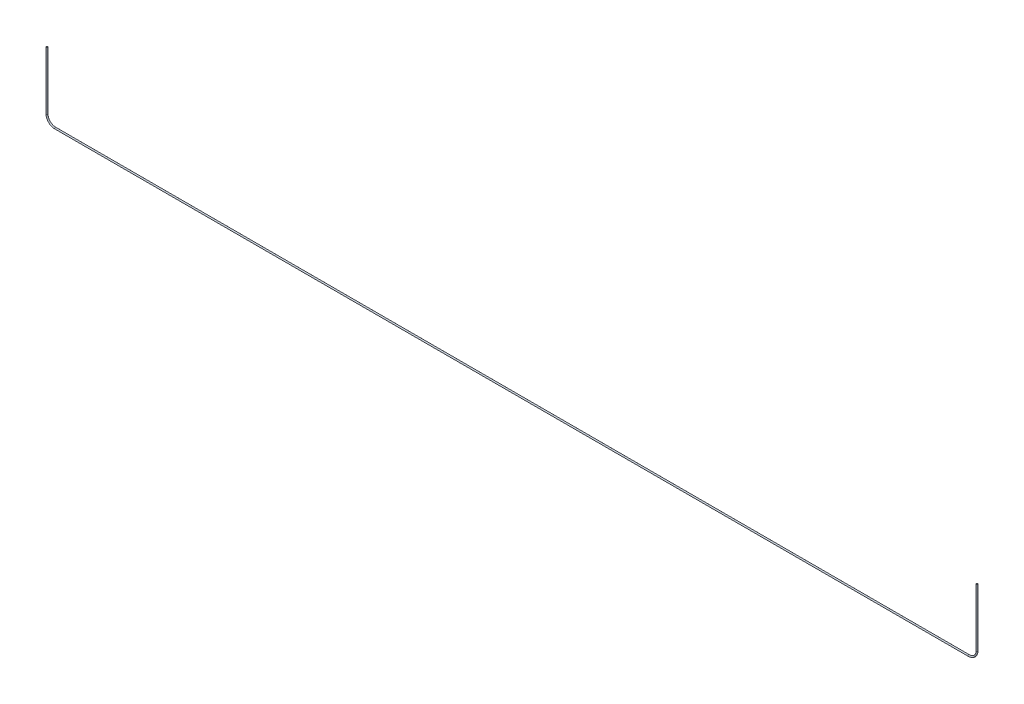
ISO-10303-21;
HEADER;
FILE_DESCRIPTION(('STEP AP214'),'2;1');
FILE_NAME('part.step','',(''),(''),'','','');
FILE_SCHEMA(('AUTOMOTIVE_DESIGN { 1 0 10303 214 1 1 1 1 }'));
ENDSEC;
DATA;
#1=APPLICATION_CONTEXT('core data for automotive mechanical design processes');
#2=APPLICATION_PROTOCOL_DEFINITION('international standard','automotive_design',2000,#1);
#3=PRODUCT_CONTEXT('',#1,'mechanical');
#4=PRODUCT('Part','Part','',(#3));
#5=PRODUCT_RELATED_PRODUCT_CATEGORY('part','',(#4));
#6=PRODUCT_DEFINITION_FORMATION('','',#4);
#7=PRODUCT_DEFINITION_CONTEXT('part definition',#1,'design');
#8=PRODUCT_DEFINITION('design','',#6,#7);
#9=PRODUCT_DEFINITION_SHAPE('','',#8);
#10=(LENGTH_UNIT() NAMED_UNIT(*) SI_UNIT(.MILLI.,.METRE.));
#11=(NAMED_UNIT(*) PLANE_ANGLE_UNIT() SI_UNIT($,.RADIAN.));
#12=(NAMED_UNIT(*) SI_UNIT($,.STERADIAN.) SOLID_ANGLE_UNIT());
#13=UNCERTAINTY_MEASURE_WITH_UNIT(LENGTH_MEASURE(1.E-05),#10,'distance_accuracy_value','');
#14=(GEOMETRIC_REPRESENTATION_CONTEXT(3) GLOBAL_UNCERTAINTY_ASSIGNED_CONTEXT((#13)) GLOBAL_UNIT_ASSIGNED_CONTEXT((#10,
#11,#12)) REPRESENTATION_CONTEXT('',''));
#15=CARTESIAN_POINT('',(0.,0.,0.));
#16=DIRECTION('',(0.,0.,1.));
#17=DIRECTION('',(1.,0.,0.));
#18=AXIS2_PLACEMENT_3D('',#15,#16,#17);
#19=CARTESIAN_POINT('',(4219.99999999904,600.000000000098,1.29229960066368E-10));
#20=DIRECTION('',(0.,0.999999999999956,0.));
#21=DIRECTION('',(0.,0.,-1.00000000000003));
#22=AXIS2_PLACEMENT_3D('',#19,#20,#21);
#23=PLANE('',#22);
#24=CARTESIAN_POINT('',(4219.99999999904,600.000000000098,1.29229960066368E-10));
#25=DIRECTION('',(0.,0.999999999999956,0.));
#26=DIRECTION('',(0.,0.,-1.00000000000003));
#27=AXIS2_PLACEMENT_3D('',#24,#25,#26);
#28=CIRCLE('',#27,6.3500000000003);
#29=CARTESIAN_POINT('',(4219.99999999904,600.000000000098,-6.34999999987125));
#30=VERTEX_POINT('',#29);
#31=EDGE_CURVE('E75',#30,#30,#28,.T.);
#32=ORIENTED_EDGE('',*,*,#31,.T.);
#33=EDGE_LOOP('',(#32));
#34=FACE_BOUND('',#33,.T.);
#35=ADVANCED_FACE('F46',(#34),#23,.T.);
#36=CARTESIAN_POINT('',(-4219.99999999934,599.999999999847,-8.92619311798626E-11));
#37=DIRECTION('',(0.,-0.999999999999956,0.));
#38=DIRECTION('',(0.,0.,-1.00000000000003));
#39=AXIS2_PLACEMENT_3D('',#36,#37,#38);
#40=PLANE('',#39);
#41=CARTESIAN_POINT('',(-4219.99999999934,599.999999999847,-8.92619311798626E-11));
#42=DIRECTION('',(0.,-0.999999999999956,0.));
#43=DIRECTION('',(0.,0.,-1.00000000000003));
#44=AXIS2_PLACEMENT_3D('',#41,#42,#43);
#45=CIRCLE('',#44,6.3500000000003);
#46=CARTESIAN_POINT('',(-4219.99999999934,599.999999999847,-6.35000000008974));
#47=VERTEX_POINT('',#46);
#48=EDGE_CURVE('E11',#47,#47,#45,.T.);
#49=ORIENTED_EDGE('',*,*,#48,.F.);
#50=EDGE_LOOP('',(#49));
#51=FACE_BOUND('',#50,.T.);
#52=ADVANCED_FACE('F85',(#51),#40,.F.);
#53=CARTESIAN_POINT('',(4219.99999999904,600.000000000098,1.29229960066368E-10));
#54=DIRECTION('',(0.,-0.999999999999956,0.));
#55=DIRECTION('',(0.,0.,-1.00000000000003));
#56=AXIS2_PLACEMENT_3D('',#53,#54,#55);
#57=CYLINDRICAL_SURFACE('',#56,6.3500000000003);
#58=CARTESIAN_POINT('',(4219.9999999993,75.0000000001099,9.32587340685131E-11));
#59=DIRECTION('',(0.,0.999999999999956,0.));
#60=DIRECTION('',(0.,0.,-1.00000000000003));
#61=AXIS2_PLACEMENT_3D('',#58,#59,#60);
#62=CIRCLE('',#61,6.3500000000003);
#63=CARTESIAN_POINT('',(4226.34999999929,75.0000000001105,9.05515662452728E-11));
#64=VERTEX_POINT('',#63);
#65=EDGE_CURVE('E71',#64,#64,#62,.T.);
#66=ORIENTED_EDGE('',*,*,#65,.T.);
#67=EDGE_LOOP('',(#66));
#68=FACE_BOUND('',#67,.T.);
#69=ORIENTED_EDGE('',*,*,#31,.F.);
#70=EDGE_LOOP('',(#69));
#71=FACE_BOUND('',#70,.T.);
#72=ADVANCED_FACE('F82',(#68,#71),#57,.T.);
#73=CARTESIAN_POINT('',(4144.99999999929,75.0000000001028,1.25233157177718E-10));
#74=DIRECTION('',(0.,0.,-1.00000000000003));
#75=DIRECTION('',(-0.999999999999859,0.,0.));
#76=AXIS2_PLACEMENT_3D('',#73,#74,#75);
#77=TOROIDAL_SURFACE('',#76,75.0000000000002,6.3500000000003);
#78=CARTESIAN_POINT('',(4144.99999999928,1.08801856413265E-10,1.05693231944315E-10));
#79=DIRECTION('',(0.999999999999859,0.,0.));
#80=DIRECTION('',(0.,0.,-1.00000000000003));
#81=AXIS2_PLACEMENT_3D('',#78,#79,#80);
#82=CIRCLE('',#81,6.3500000000003);
#83=CARTESIAN_POINT('',(4144.99999999928,-6.34999999989772,1.04038851607885E-10));
#84=VERTEX_POINT('',#83);
#85=EDGE_CURVE('E65',#84,#84,#82,.T.);
#86=CARTESIAN_POINT('',(4144.99999999929,75.0000000001028,1.25233157177718E-10));
#87=DIRECTION('',(0.,0.,-1.00000000000003));
#88=DIRECTION('',(-0.999999999999859,0.,0.));
#89=AXIS2_PLACEMENT_3D('',#86,#87,#88);
#90=CIRCLE('',#89,81.3500000000005);
#91=EDGE_CURVE('',#64,#84,#90,.T.);
#92=ORIENTED_EDGE('',*,*,#65,.F.);
#93=ORIENTED_EDGE('',*,*,#85,.T.);
#94=ORIENTED_EDGE('',*,*,#91,.T.);
#95=ORIENTED_EDGE('',*,*,#91,.F.);
#96=EDGE_LOOP('',(#92,#94,#93,#95));
#97=FACE_BOUND('',#96,.T.);
#98=ADVANCED_FACE('F84',(#97),#77,.T.);
#99=CARTESIAN_POINT('',(4144.99999999928,1.08801856413265E-10,1.05693231944315E-10));
#100=DIRECTION('',(-0.999999999999859,0.,0.));
#101=DIRECTION('',(0.,-0.99999999999999,0.));
#102=AXIS2_PLACEMENT_3D('',#99,#100,#101);
#103=CYLINDRICAL_SURFACE('',#102,6.3500000000003);
#104=CARTESIAN_POINT('',(-4144.99999999907,-1.02584607475364E-10,-1.22568621918617E-10));
#105=DIRECTION('',(0.999999999999859,0.,0.));
#106=DIRECTION('',(0.,0.,-1.00000000000003));
#107=AXIS2_PLACEMENT_3D('',#104,#105,#106);
#108=CIRCLE('',#107,6.3500000000003);
#109=CARTESIAN_POINT('',(-4144.99999999907,-6.35000000009898,-9.86402154401371E-11));
#110=VERTEX_POINT('',#109);
#111=EDGE_CURVE('E59',#110,#110,#108,.T.);
#112=CARTESIAN_POINT('',(-4144.99999999907,-6.35000000009898,-9.86402154401371E-11));
#113=CARTESIAN_POINT('',(-4058.64583333242,-6.35000000009682,-9.65118485129918E-11));
#114=CARTESIAN_POINT('',(-3972.29166666577,-6.35000000009465,-9.43834815858465E-11));
#115=CARTESIAN_POINT('',(-3799.58333333248,-6.35000000009033,-9.01267477315558E-11));
#116=CARTESIAN_POINT('',(-3713.22916666583,-6.35000000008817,-8.79983808044104E-11));
#117=CARTESIAN_POINT('',(-3540.52083333253,-6.35000000008384,-8.37416469501197E-11));
#118=CARTESIAN_POINT('',(-3454.16666666588,-6.35000000008168,-8.16132800229744E-11));
#119=CARTESIAN_POINT('',(-3281.45833333258,-6.35000000007736,-7.73565461686837E-11));
#120=CARTESIAN_POINT('',(-3195.10416666593,-6.3500000000752,-7.52281792415384E-11));
#121=CARTESIAN_POINT('',(-3022.39583333263,-6.35000000007087,-7.09714453872477E-11));
#122=CARTESIAN_POINT('',(-2936.04166666598,-6.35000000006871,-6.88430784601024E-11));
#123=CARTESIAN_POINT('',(-2763.33333333268,-6.35000000006439,-6.45863446058117E-11));
#124=CARTESIAN_POINT('',(-2676.97916666603,-6.35000000006222,-6.24579776786663E-11));
#125=CARTESIAN_POINT('',(-2504.27083333273,-6.3500000000579,-5.82012438243757E-11));
#126=CARTESIAN_POINT('',(-2417.91666666608,-6.35000000005574,-5.60728768972303E-11));
#127=CARTESIAN_POINT('',(-2245.20833333278,-6.35000000005141,-5.18161430429396E-11));
#128=CARTESIAN_POINT('',(-2158.85416666613,-6.35000000004925,-4.96877761157943E-11));
#129=CARTESIAN_POINT('',(-1986.14583333284,-6.35000000004493,-4.54310422615036E-11));
#130=CARTESIAN_POINT('',(-1899.79166666619,-6.35000000004277,-4.33026753343583E-11));
#131=CARTESIAN_POINT('',(-1727.08333333289,-6.35000000003844,-3.90459414800676E-11));
#132=CARTESIAN_POINT('',(-1640.72916666624,-6.35000000003628,-3.69175745529222E-11));
#133=CARTESIAN_POINT('',(-1468.02083333294,-6.35000000003196,-3.26608406986316E-11));
#134=CARTESIAN_POINT('',(-1381.66666666629,-6.3500000000298,-3.05324737714862E-11));
#135=CARTESIAN_POINT('',(-1208.95833333299,-6.35000000002547,-2.62757399171955E-11));
#136=CARTESIAN_POINT('',(-1122.60416666634,-6.35000000002331,-2.41473729900502E-11));
#137=CARTESIAN_POINT('',(-949.895833333041,-6.35000000001899,-1.98906391357595E-11));
#138=CARTESIAN_POINT('',(-863.541666666392,-6.35000000001682,-1.77622722086142E-11));
#139=CARTESIAN_POINT('',(-690.833333333093,-6.3500000000125,-1.35055383543235E-11));
#140=CARTESIAN_POINT('',(-604.479166666444,-6.35000000001034,-1.13771714271781E-11));
#141=CARTESIAN_POINT('',(-431.770833333145,-6.35000000000601,-7.12043757288745E-12));
#142=CARTESIAN_POINT('',(-345.416666666495,-6.35000000000385,-4.9920706457421E-12));
#143=CARTESIAN_POINT('',(-172.708333333196,-6.34999999999953,-7.35336791451418E-13));
#144=CARTESIAN_POINT('',(-86.3541666665464,-6.34999999999737,1.39303013569392E-12));
#145=CARTESIAN_POINT('',(86.3541666667524,-6.34999999999304,5.6497639899846E-12));
#146=CARTESIAN_POINT('',(172.708333333402,-6.34999999999088,7.77813091712994E-12));
#147=CARTESIAN_POINT('',(345.416666666701,-6.34999999998656,1.20348647714206E-11));
#148=CARTESIAN_POINT('',(431.77083333335,-6.3499999999844,1.4163231698566E-11));
#149=CARTESIAN_POINT('',(604.47916666665,-6.34999999998007,1.84199655528567E-11));
#150=CARTESIAN_POINT('',(690.833333333299,-6.34999999997791,2.0548332480002E-11));
#151=CARTESIAN_POINT('',(863.541666666599,-6.34999999997359,2.48050663342927E-11));
#152=CARTESIAN_POINT('',(949.895833333248,-6.34999999997142,2.6933433261438E-11));
#153=CARTESIAN_POINT('',(1122.60416666655,-6.3499999999671,3.11901671157287E-11));
#154=CARTESIAN_POINT('',(1208.9583333332,-6.34999999996494,3.3318534042874E-11));
#155=CARTESIAN_POINT('',(1381.66666666649,-6.34999999996061,3.75752678971647E-11));
#156=CARTESIAN_POINT('',(1468.02083333314,-6.34999999995845,3.97036348243101E-11));
#157=CARTESIAN_POINT('',(1640.72916666644,-6.34999999995413,4.39603686786008E-11));
#158=CARTESIAN_POINT('',(1727.08333333309,-6.34999999995197,4.60887356057461E-11));
#159=CARTESIAN_POINT('',(1899.79166666639,-6.34999999994764,5.03454694600368E-11));
#160=CARTESIAN_POINT('',(1986.14583333304,-6.34999999994548,5.24738363871821E-11));
#161=CARTESIAN_POINT('',(2158.85416666634,-6.34999999994116,5.67305702414728E-11));
#162=CARTESIAN_POINT('',(2245.20833333299,-6.349999999939,5.88589371686181E-11));
#163=CARTESIAN_POINT('',(2417.91666666629,-6.34999999993467,6.31156710229088E-11));
#164=CARTESIAN_POINT('',(2504.27083333294,-6.34999999993251,6.52440379500542E-11));
#165=CARTESIAN_POINT('',(2676.97916666624,-6.34999999992819,6.95007718043449E-11));
#166=CARTESIAN_POINT('',(2763.33333333289,-6.34999999992602,7.16291387314902E-11));
#167=CARTESIAN_POINT('',(2936.04166666619,-6.3499999999217,7.58858725857809E-11));
#168=CARTESIAN_POINT('',(3022.39583333284,-6.34999999991954,7.80142395129262E-11));
#169=CARTESIAN_POINT('',(3195.10416666613,-6.34999999991521,8.22709733672169E-11));
#170=CARTESIAN_POINT('',(3281.45833333278,-6.34999999991305,8.43993402943622E-11));
#171=CARTESIAN_POINT('',(3454.16666666608,-6.34999999990873,8.86560741486529E-11));
#172=CARTESIAN_POINT('',(3540.52083333273,-6.34999999990657,9.07844410757983E-11));
#173=CARTESIAN_POINT('',(3713.22916666603,-6.34999999990224,9.5041174930089E-11));
#174=CARTESIAN_POINT('',(3799.58333333268,-6.34999999990008,9.71695418572343E-11));
#175=CARTESIAN_POINT('',(3972.29166666598,-6.34999999989576,1.01426275711525E-10));
#176=CARTESIAN_POINT('',(4058.64583333263,-6.34999999989359,1.0355464263867E-10));
#177=CARTESIAN_POINT('',(4144.99999999928,-6.34999999989143,1.05683009565816E-10));
#178=B_SPLINE_CURVE_WITH_KNOTS('',3,(#112,#113,#114,#115,#116,#117,#118,#119,#120,#121,#122,
#123,#124,#125,#126,#127,#128,#129,#130,#131,#132,#133,#134,#135,#136,#137,#138,#139,#140,#141,
#142,#143,#144,#145,#146,#147,#148,#149,#150,#151,#152,#153,#154,#155,#156,#157,#158,#159,#160,
#161,#162,#163,#164,#165,#166,#167,#168,#169,#170,#171,#172,#173,#174,#175,#176,#177),
.UNSPECIFIED.,.F.,.F.,(4,2,2,2,2,2,2,2,2,2,2,2,2,2,2,2,2,2,2,2,2,2,2,2,2,2,2,2,2,2,2,2,4),(0.,
259.062499999947,518.124999999897,777.187499999847,1036.24999999979,1295.31249999974,
1554.37499999969,1813.43749999964,2072.49999999959,2331.56249999954,2590.62499999949,
2849.68749999943,3108.74999999938,3367.81249999933,3626.87499999928,3885.93749999923,
4144.99999999918,4404.06249999912,4663.12499999907,4922.18749999902,5181.24999999897,
5440.31249999892,5699.37499999887,5958.43749999882,6217.49999999877,6476.56249999871,
6735.62499999866,6994.68749999861,7253.74999999856,7512.81249999851,7771.87499999846,
8030.93749999841,8289.99999999835),.UNSPECIFIED.);
#179=EDGE_CURVE('BSEAM92',#110,#84,#178,.T.);
#180=ORIENTED_EDGE('',*,*,#111,.T.);
#181=ORIENTED_EDGE('',*,*,#85,.F.);
#182=ORIENTED_EDGE('',*,*,#179,.T.);
#183=ORIENTED_EDGE('',*,*,#179,.F.);
#184=EDGE_LOOP('',(#180,#182,#181,#183));
#185=FACE_BOUND('',#184,.T.);
#186=ADVANCED_FACE('F92',(#185),#103,.T.);
#187=CARTESIAN_POINT('',(-4144.99999999907,74.9999999998825,-1.28785870856518E-10));
#188=DIRECTION('',(0.,0.,-1.00000000000003));
#189=DIRECTION('',(-0.999999999999859,0.,0.));
#190=AXIS2_PLACEMENT_3D('',#187,#188,#189);
#191=TOROIDAL_SURFACE('',#190,74.9999999999999,6.3500000000003);
#192=CARTESIAN_POINT('',(-4219.99999999907,74.9999999999016,-1.13686837721616E-10));
#193=DIRECTION('',(0.,-0.999999999999956,0.));
#194=DIRECTION('',(0.,0.,-1.00000000000003));
#195=AXIS2_PLACEMENT_3D('',#192,#193,#194);
#196=CIRCLE('',#195,6.3500000000003);
#197=CARTESIAN_POINT('',(-4226.34999999907,74.9999999999032,-1.12408452916195E-10));
#198=VERTEX_POINT('',#197);
#199=EDGE_CURVE('E53',#198,#198,#196,.T.);
#200=CARTESIAN_POINT('',(-4144.99999999907,74.9999999998825,-1.28785870856518E-10));
#201=DIRECTION('',(0.,0.,-1.00000000000003));
#202=DIRECTION('',(-0.999999999999859,0.,0.));
#203=AXIS2_PLACEMENT_3D('',#200,#201,#202);
#204=CIRCLE('',#203,81.3500000000002);
#205=EDGE_CURVE('',#110,#198,#204,.T.);
#206=ORIENTED_EDGE('',*,*,#111,.F.);
#207=ORIENTED_EDGE('',*,*,#199,.T.);
#208=ORIENTED_EDGE('',*,*,#205,.T.);
#209=ORIENTED_EDGE('',*,*,#205,.F.);
#210=EDGE_LOOP('',(#206,#208,#207,#209));
#211=FACE_BOUND('',#210,.T.);
#212=ADVANCED_FACE('F98',(#211),#191,.T.);
#213=CARTESIAN_POINT('',(-4219.99999999907,74.9999999999016,-1.13686837721616E-10));
#214=DIRECTION('',(0.,0.999999999999956,0.));
#215=DIRECTION('',(0.,0.,1.00000000000003));
#216=AXIS2_PLACEMENT_3D('',#213,#214,#215);
#217=CYLINDRICAL_SURFACE('',#216,6.3500000000003);
#218=ORIENTED_EDGE('',*,*,#48,.T.);
#219=EDGE_LOOP('',(#218));
#220=FACE_BOUND('',#219,.T.);
#221=ORIENTED_EDGE('',*,*,#199,.F.);
#222=EDGE_LOOP('',(#221));
#223=FACE_BOUND('',#222,.T.);
#224=ADVANCED_FACE('F96',(#220,#223),#217,.T.);
#225=CLOSED_SHELL('',(#35,#52,#72,#98,#186,#212,#224));
#226=MANIFOLD_SOLID_BREP('B2',#225);
#227=ADVANCED_BREP_SHAPE_REPRESENTATION('',(#18,#226),#14);
#228=SHAPE_DEFINITION_REPRESENTATION(#9,#227);
ENDSEC;
END-ISO-10303-21;
